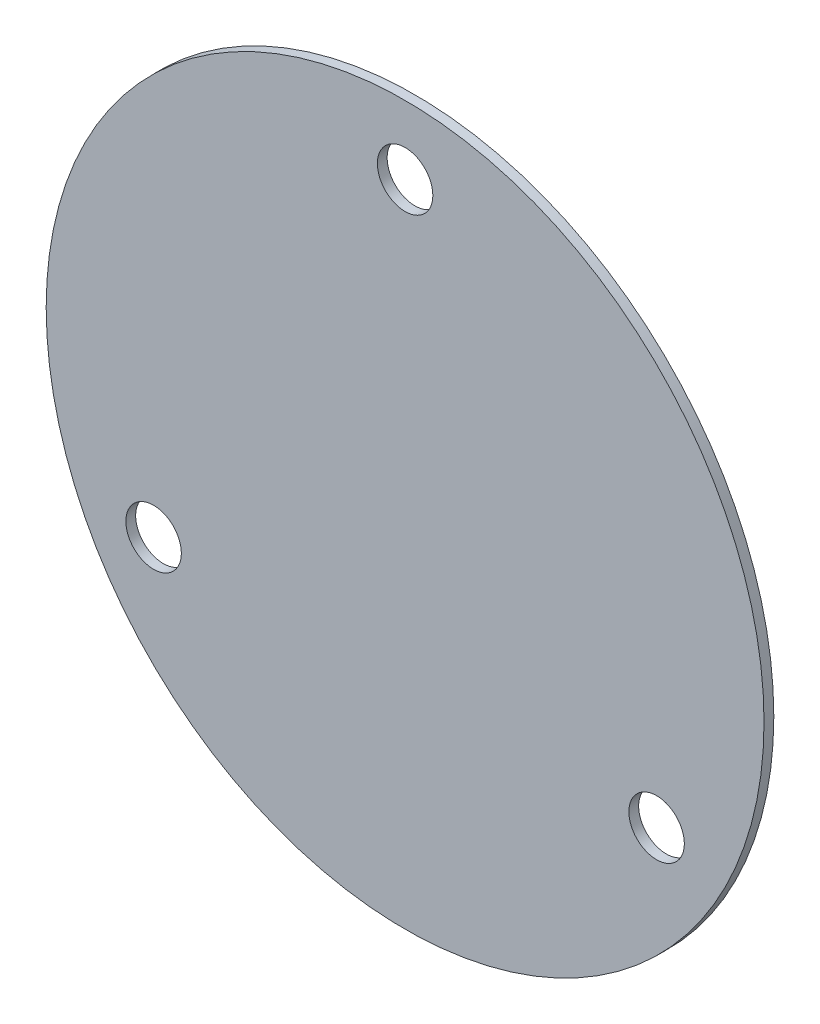
ISO-10303-21;
HEADER;
FILE_DESCRIPTION(('STEP AP214'),'2;1');
FILE_NAME('part.step','',(''),(''),'','','');
FILE_SCHEMA(('AUTOMOTIVE_DESIGN { 1 0 10303 214 1 1 1 1 }'));
ENDSEC;
DATA;
#1=APPLICATION_CONTEXT('core data for automotive mechanical design processes');
#2=APPLICATION_PROTOCOL_DEFINITION('international standard','automotive_design',2000,#1);
#3=PRODUCT_CONTEXT('',#1,'mechanical');
#4=PRODUCT('Part','Part','',(#3));
#5=PRODUCT_RELATED_PRODUCT_CATEGORY('part','',(#4));
#6=PRODUCT_DEFINITION_FORMATION('','',#4);
#7=PRODUCT_DEFINITION_CONTEXT('part definition',#1,'design');
#8=PRODUCT_DEFINITION('design','',#6,#7);
#9=PRODUCT_DEFINITION_SHAPE('','',#8);
#10=(LENGTH_UNIT() NAMED_UNIT(*) SI_UNIT(.MILLI.,.METRE.));
#11=(NAMED_UNIT(*) PLANE_ANGLE_UNIT() SI_UNIT($,.RADIAN.));
#12=(NAMED_UNIT(*) SI_UNIT($,.STERADIAN.) SOLID_ANGLE_UNIT());
#13=UNCERTAINTY_MEASURE_WITH_UNIT(LENGTH_MEASURE(1.E-05),#10,'distance_accuracy_value','');
#14=(GEOMETRIC_REPRESENTATION_CONTEXT(3) GLOBAL_UNCERTAINTY_ASSIGNED_CONTEXT((#13)) GLOBAL_UNIT_ASSIGNED_CONTEXT((#10,
#11,#12)) REPRESENTATION_CONTEXT('',''));
#15=CARTESIAN_POINT('',(0.,0.,0.));
#16=DIRECTION('',(0.,0.,1.));
#17=DIRECTION('',(1.,0.,0.));
#18=AXIS2_PLACEMENT_3D('',#15,#16,#17);
#19=CARTESIAN_POINT('',(0.,0.,-3.));
#20=DIRECTION('',(0.,0.,1.));
#21=DIRECTION('',(1.,0.,0.));
#22=AXIS2_PLACEMENT_3D('',#19,#20,#21);
#23=CYLINDRICAL_SURFACE('',#22,110.);
#24=CARTESIAN_POINT('',(0.,0.,-3.));
#25=DIRECTION('',(0.,0.,1.));
#26=DIRECTION('',(1.,0.,0.));
#27=AXIS2_PLACEMENT_3D('',#24,#25,#26);
#28=CIRCLE('',#27,110.);
#29=CARTESIAN_POINT('',(110.,0.,-3.));
#30=VERTEX_POINT('',#29);
#31=EDGE_CURVE('E10',#30,#30,#28,.T.);
#32=ORIENTED_EDGE('',*,*,#31,.T.);
#33=EDGE_LOOP('',(#32));
#34=FACE_BOUND('',#33,.T.);
#35=CARTESIAN_POINT('',(0.,0.,0.));
#36=DIRECTION('',(0.,0.,1.));
#37=DIRECTION('',(1.,0.,0.));
#38=AXIS2_PLACEMENT_3D('',#35,#36,#37);
#39=CIRCLE('',#38,110.);
#40=CARTESIAN_POINT('',(110.,0.,0.));
#41=VERTEX_POINT('',#40);
#42=EDGE_CURVE('E50',#41,#41,#39,.T.);
#43=ORIENTED_EDGE('',*,*,#42,.F.);
#44=EDGE_LOOP('',(#43));
#45=FACE_BOUND('',#44,.T.);
#46=ADVANCED_FACE('F47',(#34,#45),#23,.T.);
#47=CARTESIAN_POINT('',(0.,0.,-3.));
#48=DIRECTION('',(0.,0.,1.));
#49=DIRECTION('',(1.,0.,0.));
#50=AXIS2_PLACEMENT_3D('',#47,#48,#49);
#51=PLANE('',#50);
#52=CARTESIAN_POINT('',(-77.0762609368173,-44.4999999999969,-3.));
#53=DIRECTION('',(0.,0.,1.));
#54=DIRECTION('',(1.,0.,0.));
#55=AXIS2_PLACEMENT_3D('',#52,#53,#54);
#56=CIRCLE('',#55,8.49999999999705);
#57=CARTESIAN_POINT('',(-68.5762609368202,-44.4999999999969,-3.));
#58=VERTEX_POINT('',#57);
#59=EDGE_CURVE('E74',#58,#58,#56,.T.);
#60=ORIENTED_EDGE('',*,*,#59,.T.);
#61=EDGE_LOOP('',(#60));
#62=FACE_BOUND('',#61,.T.);
#63=CARTESIAN_POINT('',(77.0762609368112,-44.5000000000003,-3.));
#64=DIRECTION('',(0.,0.,1.));
#65=DIRECTION('',(1.,0.,0.));
#66=AXIS2_PLACEMENT_3D('',#63,#64,#65);
#67=CIRCLE('',#66,8.4999999999992);
#68=CARTESIAN_POINT('',(85.5762609368104,-44.5000000000003,-3.));
#69=VERTEX_POINT('',#68);
#70=EDGE_CURVE('E66',#69,#69,#67,.T.);
#71=ORIENTED_EDGE('',*,*,#70,.T.);
#72=EDGE_LOOP('',(#71));
#73=FACE_BOUND('',#72,.T.);
#74=CARTESIAN_POINT('',(0.,89.,-3.));
#75=DIRECTION('',(0.,0.,1.));
#76=DIRECTION('',(1.,0.,0.));
#77=AXIS2_PLACEMENT_3D('',#74,#75,#76);
#78=CIRCLE('',#77,8.5);
#79=CARTESIAN_POINT('',(8.5,89.,-3.));
#80=VERTEX_POINT('',#79);
#81=EDGE_CURVE('E60',#80,#80,#78,.T.);
#82=ORIENTED_EDGE('',*,*,#81,.T.);
#83=EDGE_LOOP('',(#82));
#84=FACE_BOUND('',#83,.T.);
#85=ORIENTED_EDGE('',*,*,#31,.F.);
#86=EDGE_LOOP('',(#85));
#87=FACE_BOUND('',#86,.T.);
#88=ADVANCED_FACE('F87',(#62,#73,#84,#87),#51,.F.);
#89=CARTESIAN_POINT('',(0.,0.,0.));
#90=DIRECTION('',(0.,0.,1.));
#91=DIRECTION('',(1.,0.,0.));
#92=AXIS2_PLACEMENT_3D('',#89,#90,#91);
#93=PLANE('',#92);
#94=CARTESIAN_POINT('',(-77.0762609368173,-44.4999999999969,0.));
#95=DIRECTION('',(0.,0.,1.));
#96=DIRECTION('',(1.,0.,0.));
#97=AXIS2_PLACEMENT_3D('',#94,#95,#96);
#98=CIRCLE('',#97,8.49999999999705);
#99=CARTESIAN_POINT('',(-68.5762609368202,-44.4999999999969,0.));
#100=VERTEX_POINT('',#99);
#101=EDGE_CURVE('E78',#100,#100,#98,.T.);
#102=ORIENTED_EDGE('',*,*,#101,.F.);
#103=EDGE_LOOP('',(#102));
#104=FACE_BOUND('',#103,.T.);
#105=CARTESIAN_POINT('',(77.0762609368112,-44.5000000000003,0.));
#106=DIRECTION('',(0.,0.,1.));
#107=DIRECTION('',(1.,0.,0.));
#108=AXIS2_PLACEMENT_3D('',#105,#106,#107);
#109=CIRCLE('',#108,8.4999999999992);
#110=CARTESIAN_POINT('',(85.5762609368104,-44.5000000000003,0.));
#111=VERTEX_POINT('',#110);
#112=EDGE_CURVE('E70',#111,#111,#109,.T.);
#113=ORIENTED_EDGE('',*,*,#112,.F.);
#114=EDGE_LOOP('',(#113));
#115=FACE_BOUND('',#114,.T.);
#116=CARTESIAN_POINT('',(0.,89.,0.));
#117=DIRECTION('',(0.,0.,1.));
#118=DIRECTION('',(1.,0.,0.));
#119=AXIS2_PLACEMENT_3D('',#116,#117,#118);
#120=CIRCLE('',#119,8.5);
#121=CARTESIAN_POINT('',(8.5,89.,0.));
#122=VERTEX_POINT('',#121);
#123=EDGE_CURVE('E62',#122,#122,#120,.T.);
#124=ORIENTED_EDGE('',*,*,#123,.F.);
#125=EDGE_LOOP('',(#124));
#126=FACE_BOUND('',#125,.T.);
#127=ORIENTED_EDGE('',*,*,#42,.T.);
#128=EDGE_LOOP('',(#127));
#129=FACE_BOUND('',#128,.T.);
#130=ADVANCED_FACE('F97',(#104,#115,#126,#129),#93,.T.);
#131=CARTESIAN_POINT('',(0.,89.,-3.));
#132=DIRECTION('',(0.,0.,1.));
#133=DIRECTION('',(1.,0.,0.));
#134=AXIS2_PLACEMENT_3D('',#131,#132,#133);
#135=CYLINDRICAL_SURFACE('',#134,8.5);
#136=ORIENTED_EDGE('',*,*,#81,.F.);
#137=EDGE_LOOP('',(#136));
#138=FACE_BOUND('',#137,.T.);
#139=ORIENTED_EDGE('',*,*,#123,.T.);
#140=EDGE_LOOP('',(#139));
#141=FACE_BOUND('',#140,.T.);
#142=ADVANCED_FACE('F100',(#138,#141),#135,.F.);
#143=CARTESIAN_POINT('',(77.0762609368112,-44.5000000000003,-3.));
#144=DIRECTION('',(0.,0.,1.));
#145=DIRECTION('',(1.,0.,0.));
#146=AXIS2_PLACEMENT_3D('',#143,#144,#145);
#147=CYLINDRICAL_SURFACE('',#146,8.4999999999992);
#148=ORIENTED_EDGE('',*,*,#70,.F.);
#149=EDGE_LOOP('',(#148));
#150=FACE_BOUND('',#149,.T.);
#151=ORIENTED_EDGE('',*,*,#112,.T.);
#152=EDGE_LOOP('',(#151));
#153=FACE_BOUND('',#152,.T.);
#154=ADVANCED_FACE('F93',(#150,#153),#147,.F.);
#155=CARTESIAN_POINT('',(-77.0762609368173,-44.4999999999969,-3.));
#156=DIRECTION('',(0.,0.,1.));
#157=DIRECTION('',(1.,0.,0.));
#158=AXIS2_PLACEMENT_3D('',#155,#156,#157);
#159=CYLINDRICAL_SURFACE('',#158,8.49999999999705);
#160=ORIENTED_EDGE('',*,*,#59,.F.);
#161=EDGE_LOOP('',(#160));
#162=FACE_BOUND('',#161,.T.);
#163=ORIENTED_EDGE('',*,*,#101,.T.);
#164=EDGE_LOOP('',(#163));
#165=FACE_BOUND('',#164,.T.);
#166=ADVANCED_FACE('F90',(#162,#165),#159,.F.);
#167=CLOSED_SHELL('',(#46,#88,#130,#142,#154,#166));
#168=MANIFOLD_SOLID_BREP('B2',#167);
#169=ADVANCED_BREP_SHAPE_REPRESENTATION('',(#18,#168),#14);
#170=SHAPE_DEFINITION_REPRESENTATION(#9,#169);
ENDSEC;
END-ISO-10303-21;
